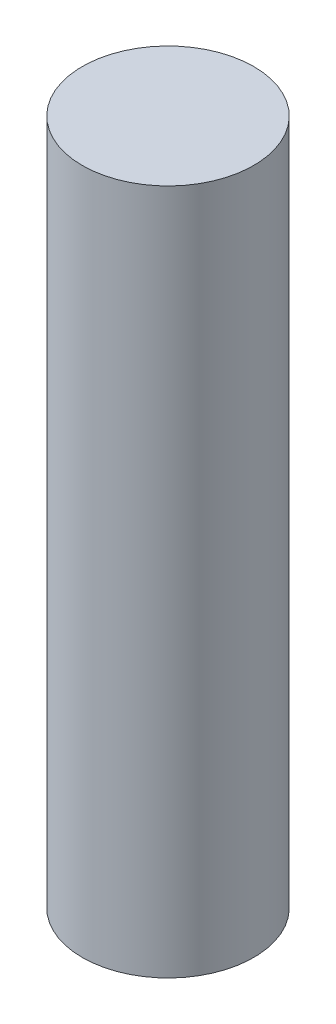
ISO-10303-21;
HEADER;
FILE_DESCRIPTION(('STEP AP214'),'2;1');
FILE_NAME('part.step','',(''),(''),'','','');
FILE_SCHEMA(('AUTOMOTIVE_DESIGN { 1 0 10303 214 1 1 1 1 }'));
ENDSEC;
DATA;
#1=APPLICATION_CONTEXT('core data for automotive mechanical design processes');
#2=APPLICATION_PROTOCOL_DEFINITION('international standard','automotive_design',2000,#1);
#3=PRODUCT_CONTEXT('',#1,'mechanical');
#4=PRODUCT('Part','Part','',(#3));
#5=PRODUCT_RELATED_PRODUCT_CATEGORY('part','',(#4));
#6=PRODUCT_DEFINITION_FORMATION('','',#4);
#7=PRODUCT_DEFINITION_CONTEXT('part definition',#1,'design');
#8=PRODUCT_DEFINITION('design','',#6,#7);
#9=PRODUCT_DEFINITION_SHAPE('','',#8);
#10=(LENGTH_UNIT() NAMED_UNIT(*) SI_UNIT(.MILLI.,.METRE.));
#11=(NAMED_UNIT(*) PLANE_ANGLE_UNIT() SI_UNIT($,.RADIAN.));
#12=(NAMED_UNIT(*) SI_UNIT($,.STERADIAN.) SOLID_ANGLE_UNIT());
#13=UNCERTAINTY_MEASURE_WITH_UNIT(LENGTH_MEASURE(1.E-05),#10,'distance_accuracy_value','');
#14=(GEOMETRIC_REPRESENTATION_CONTEXT(3) GLOBAL_UNCERTAINTY_ASSIGNED_CONTEXT((#13)) GLOBAL_UNIT_ASSIGNED_CONTEXT((#10,
#11,#12)) REPRESENTATION_CONTEXT('',''));
#15=CARTESIAN_POINT('',(0.,0.,0.));
#16=DIRECTION('',(0.,0.,1.));
#17=DIRECTION('',(1.,0.,0.));
#18=AXIS2_PLACEMENT_3D('',#15,#16,#17);
#19=CARTESIAN_POINT('',(0.,76.2,0.));
#20=DIRECTION('',(0.,-1.,0.));
#21=DIRECTION('',(0.,0.,-1.));
#22=AXIS2_PLACEMENT_3D('',#19,#20,#21);
#23=CYLINDRICAL_SURFACE('',#22,9.525);
#24=CARTESIAN_POINT('',(0.,76.2,0.));
#25=DIRECTION('',(0.,1.,0.));
#26=DIRECTION('',(0.,0.,1.));
#27=AXIS2_PLACEMENT_3D('',#24,#25,#26);
#28=CIRCLE('',#27,9.525);
#29=CARTESIAN_POINT('',(0.,76.2,-9.525));
#30=VERTEX_POINT('',#29);
#31=EDGE_CURVE('E10',#30,#30,#28,.T.);
#32=CARTESIAN_POINT('',(0.,0.,0.));
#33=DIRECTION('',(0.,1.,0.));
#34=DIRECTION('',(0.,0.,1.));
#35=AXIS2_PLACEMENT_3D('',#32,#33,#34);
#36=CIRCLE('',#35,9.525);
#37=CARTESIAN_POINT('',(0.,0.,-9.525));
#38=VERTEX_POINT('',#37);
#39=EDGE_CURVE('E33',#38,#38,#36,.T.);
#40=CARTESIAN_POINT('',(0.,76.2,-9.525));
#41=CARTESIAN_POINT('',(0.,75.40625,-9.525));
#42=CARTESIAN_POINT('',(0.,74.6125,-9.525));
#43=CARTESIAN_POINT('',(0.,73.025,-9.525));
#44=CARTESIAN_POINT('',(0.,72.23125,-9.525));
#45=CARTESIAN_POINT('',(0.,70.64375,-9.525));
#46=CARTESIAN_POINT('',(0.,69.85,-9.525));
#47=CARTESIAN_POINT('',(0.,68.2625,-9.525));
#48=CARTESIAN_POINT('',(0.,67.46875,-9.525));
#49=CARTESIAN_POINT('',(0.,65.88125,-9.525));
#50=CARTESIAN_POINT('',(0.,65.0875,-9.525));
#51=CARTESIAN_POINT('',(0.,63.5,-9.525));
#52=CARTESIAN_POINT('',(0.,62.70625,-9.525));
#53=CARTESIAN_POINT('',(0.,61.11875,-9.525));
#54=CARTESIAN_POINT('',(0.,60.325,-9.525));
#55=CARTESIAN_POINT('',(0.,58.7375,-9.525));
#56=CARTESIAN_POINT('',(0.,57.94375,-9.525));
#57=CARTESIAN_POINT('',(0.,56.35625,-9.525));
#58=CARTESIAN_POINT('',(0.,55.5625,-9.525));
#59=CARTESIAN_POINT('',(0.,53.975,-9.525));
#60=CARTESIAN_POINT('',(0.,53.18125,-9.525));
#61=CARTESIAN_POINT('',(0.,51.59375,-9.525));
#62=CARTESIAN_POINT('',(0.,50.8,-9.525));
#63=CARTESIAN_POINT('',(0.,49.2125,-9.525));
#64=CARTESIAN_POINT('',(0.,48.41875,-9.525));
#65=CARTESIAN_POINT('',(0.,46.83125,-9.525));
#66=CARTESIAN_POINT('',(0.,46.0375,-9.525));
#67=CARTESIAN_POINT('',(0.,44.45,-9.525));
#68=CARTESIAN_POINT('',(0.,43.65625,-9.525));
#69=CARTESIAN_POINT('',(0.,42.06875,-9.525));
#70=CARTESIAN_POINT('',(0.,41.275,-9.525));
#71=CARTESIAN_POINT('',(0.,39.6875,-9.525));
#72=CARTESIAN_POINT('',(0.,38.89375,-9.525));
#73=CARTESIAN_POINT('',(0.,37.30625,-9.525));
#74=CARTESIAN_POINT('',(0.,36.5125,-9.525));
#75=CARTESIAN_POINT('',(0.,34.925,-9.525));
#76=CARTESIAN_POINT('',(0.,34.13125,-9.525));
#77=CARTESIAN_POINT('',(0.,32.54375,-9.525));
#78=CARTESIAN_POINT('',(0.,31.75,-9.525));
#79=CARTESIAN_POINT('',(0.,30.1625,-9.525));
#80=CARTESIAN_POINT('',(0.,29.36875,-9.525));
#81=CARTESIAN_POINT('',(0.,27.78125,-9.525));
#82=CARTESIAN_POINT('',(0.,26.9875,-9.525));
#83=CARTESIAN_POINT('',(0.,25.4,-9.525));
#84=CARTESIAN_POINT('',(0.,24.60625,-9.525));
#85=CARTESIAN_POINT('',(0.,23.01875,-9.525));
#86=CARTESIAN_POINT('',(0.,22.225,-9.525));
#87=CARTESIAN_POINT('',(0.,20.6375,-9.525));
#88=CARTESIAN_POINT('',(0.,19.84375,-9.525));
#89=CARTESIAN_POINT('',(0.,18.25625,-9.525));
#90=CARTESIAN_POINT('',(0.,17.4625,-9.525));
#91=CARTESIAN_POINT('',(0.,15.875,-9.525));
#92=CARTESIAN_POINT('',(0.,15.08125,-9.525));
#93=CARTESIAN_POINT('',(0.,13.49375,-9.525));
#94=CARTESIAN_POINT('',(0.,12.7,-9.525));
#95=CARTESIAN_POINT('',(0.,11.1125,-9.525));
#96=CARTESIAN_POINT('',(0.,10.31875,-9.525));
#97=CARTESIAN_POINT('',(0.,8.73125,-9.525));
#98=CARTESIAN_POINT('',(0.,7.93750000000001,-9.525));
#99=CARTESIAN_POINT('',(0.,6.35,-9.525));
#100=CARTESIAN_POINT('',(0.,5.55625,-9.525));
#101=CARTESIAN_POINT('',(0.,3.96875,-9.525));
#102=CARTESIAN_POINT('',(0.,3.175,-9.525));
#103=CARTESIAN_POINT('',(0.,1.5875,-9.525));
#104=CARTESIAN_POINT('',(0.,0.793750000000001,-9.525));
#105=CARTESIAN_POINT('',(0.,0.,-9.525));
#106=B_SPLINE_CURVE_WITH_KNOTS('',3,(#40,#41,#42,#43,#44,#45,#46,#47,#48,#49,#50,#51,#52,#53,
#54,#55,#56,#57,#58,#59,#60,#61,#62,#63,#64,#65,#66,#67,#68,#69,#70,#71,#72,#73,#74,#75,#76,#77,
#78,#79,#80,#81,#82,#83,#84,#85,#86,#87,#88,#89,#90,#91,#92,#93,#94,#95,#96,#97,#98,#99,#100,
#101,#102,#103,#104,#105),.UNSPECIFIED.,.F.,.F.,(4,2,2,2,2,2,2,2,2,2,2,2,2,2,2,2,2,2,2,2,2,2,2,
2,2,2,2,2,2,2,2,2,4),(0.,2.38125,4.7625,7.14375,9.52500000000001,11.90625,14.2875,16.66875,
19.05,21.43125,23.8125,26.19375,28.575,30.95625,33.3375,35.71875,38.1,40.48125,42.8625,45.24375,
47.625,50.00625,52.3875,54.76875,57.15,59.53125,61.9125,64.29375,66.675,69.05625,71.4375,
73.81875,76.2),.UNSPECIFIED.);
#107=EDGE_CURVE('BSEAM30',#30,#38,#106,.T.);
#108=ORIENTED_EDGE('',*,*,#31,.F.);
#109=ORIENTED_EDGE('',*,*,#39,.T.);
#110=ORIENTED_EDGE('',*,*,#107,.T.);
#111=ORIENTED_EDGE('',*,*,#107,.F.);
#112=EDGE_LOOP('',(#108,#110,#109,#111));
#113=FACE_BOUND('',#112,.T.);
#114=ADVANCED_FACE('F30',(#113),#23,.T.);
#115=CARTESIAN_POINT('',(0.,76.2,0.));
#116=DIRECTION('',(0.,1.,0.));
#117=DIRECTION('',(0.,0.,1.));
#118=AXIS2_PLACEMENT_3D('',#115,#116,#117);
#119=PLANE('',#118);
#120=ORIENTED_EDGE('',*,*,#31,.T.);
#121=EDGE_LOOP('',(#120));
#122=FACE_BOUND('',#121,.T.);
#123=ADVANCED_FACE('F45',(#122),#119,.T.);
#124=CARTESIAN_POINT('',(0.,0.,0.));
#125=DIRECTION('',(0.,1.,0.));
#126=DIRECTION('',(0.,0.,1.));
#127=AXIS2_PLACEMENT_3D('',#124,#125,#126);
#128=PLANE('',#127);
#129=ORIENTED_EDGE('',*,*,#39,.F.);
#130=EDGE_LOOP('',(#129));
#131=FACE_BOUND('',#130,.T.);
#132=ADVANCED_FACE('F43',(#131),#128,.F.);
#133=CLOSED_SHELL('',(#114,#123,#132));
#134=MANIFOLD_SOLID_BREP('B2',#133);
#135=ADVANCED_BREP_SHAPE_REPRESENTATION('',(#18,#134),#14);
#136=SHAPE_DEFINITION_REPRESENTATION(#9,#135);
ENDSEC;
END-ISO-10303-21;
